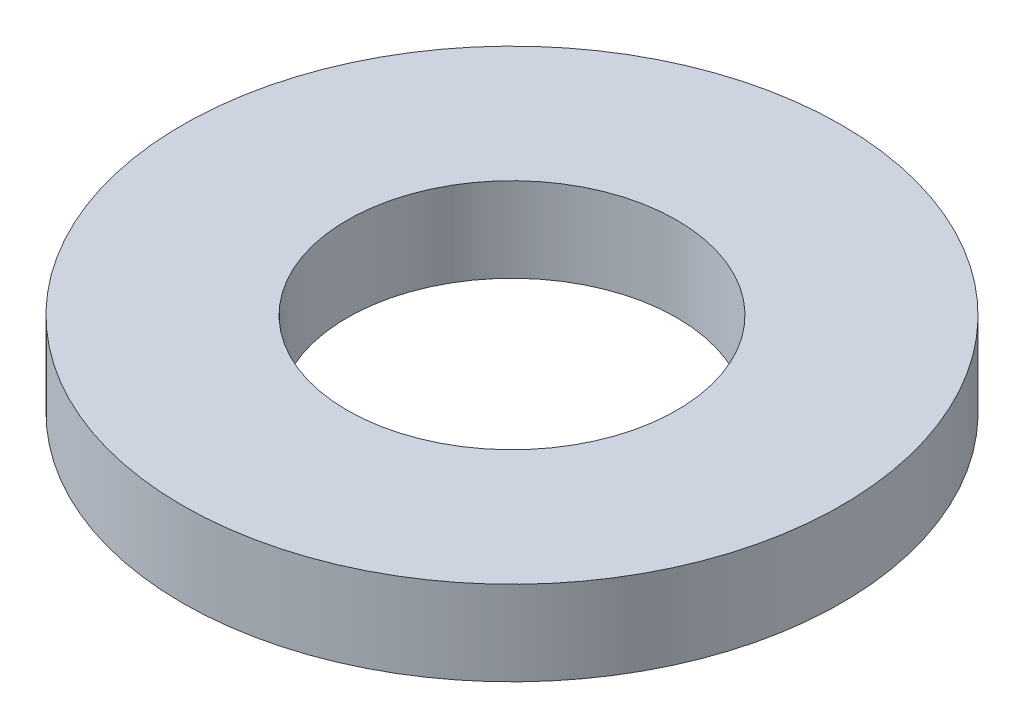
ISO-10303-21;
HEADER;
FILE_DESCRIPTION(('STEP AP214'),'2;1');
FILE_NAME('part.step','',(''),(''),'','','');
FILE_SCHEMA(('AUTOMOTIVE_DESIGN { 1 0 10303 214 1 1 1 1 }'));
ENDSEC;
DATA;
#1=APPLICATION_CONTEXT('core data for automotive mechanical design processes');
#2=APPLICATION_PROTOCOL_DEFINITION('international standard','automotive_design',2000,#1);
#3=PRODUCT_CONTEXT('',#1,'mechanical');
#4=PRODUCT('Part','Part','',(#3));
#5=PRODUCT_RELATED_PRODUCT_CATEGORY('part','',(#4));
#6=PRODUCT_DEFINITION_FORMATION('','',#4);
#7=PRODUCT_DEFINITION_CONTEXT('part definition',#1,'design');
#8=PRODUCT_DEFINITION('design','',#6,#7);
#9=PRODUCT_DEFINITION_SHAPE('','',#8);
#10=(LENGTH_UNIT() NAMED_UNIT(*) SI_UNIT(.MILLI.,.METRE.));
#11=(NAMED_UNIT(*) PLANE_ANGLE_UNIT() SI_UNIT($,.RADIAN.));
#12=(NAMED_UNIT(*) SI_UNIT($,.STERADIAN.) SOLID_ANGLE_UNIT());
#13=UNCERTAINTY_MEASURE_WITH_UNIT(LENGTH_MEASURE(1.E-05),#10,'distance_accuracy_value','');
#14=(GEOMETRIC_REPRESENTATION_CONTEXT(3) GLOBAL_UNCERTAINTY_ASSIGNED_CONTEXT((#13)) GLOBAL_UNIT_ASSIGNED_CONTEXT((#10,
#11,#12)) REPRESENTATION_CONTEXT('',''));
#15=CARTESIAN_POINT('',(0.,0.,0.));
#16=DIRECTION('',(0.,0.,1.));
#17=DIRECTION('',(1.,0.,0.));
#18=AXIS2_PLACEMENT_3D('',#15,#16,#17);
#19=CARTESIAN_POINT('',(0.,1.016,0.));
#20=DIRECTION('',(0.,-1.,0.));
#21=DIRECTION('',(0.,0.,-1.));
#22=AXIS2_PLACEMENT_3D('',#19,#20,#21);
#23=CYLINDRICAL_SURFACE('',#22,3.9624);
#24=CARTESIAN_POINT('',(0.,1.016,0.));
#25=DIRECTION('',(0.,1.,0.));
#26=DIRECTION('',(0.,0.,1.));
#27=AXIS2_PLACEMENT_3D('',#24,#25,#26);
#28=CIRCLE('',#27,3.9624);
#29=CARTESIAN_POINT('',(0.,1.016,3.9624));
#30=VERTEX_POINT('',#29);
#31=EDGE_CURVE('E10',#30,#30,#28,.T.);
#32=ORIENTED_EDGE('',*,*,#31,.F.);
#33=EDGE_LOOP('',(#32));
#34=FACE_BOUND('',#33,.T.);
#35=CARTESIAN_POINT('',(0.,0.,0.));
#36=DIRECTION('',(0.,1.,0.));
#37=DIRECTION('',(0.,0.,1.));
#38=AXIS2_PLACEMENT_3D('',#35,#36,#37);
#39=CIRCLE('',#38,3.9624);
#40=CARTESIAN_POINT('',(0.,0.,3.9624));
#41=VERTEX_POINT('',#40);
#42=EDGE_CURVE('E33',#41,#41,#39,.T.);
#43=ORIENTED_EDGE('',*,*,#42,.T.);
#44=EDGE_LOOP('',(#43));
#45=FACE_BOUND('',#44,.T.);
#46=ADVANCED_FACE('F30',(#34,#45),#23,.T.);
#47=CARTESIAN_POINT('',(0.,1.016,0.));
#48=DIRECTION('',(0.,1.,0.));
#49=DIRECTION('',(0.,0.,1.));
#50=AXIS2_PLACEMENT_3D('',#47,#48,#49);
#51=PLANE('',#50);
#52=CARTESIAN_POINT('',(0.,1.016,0.));
#53=DIRECTION('',(0.,1.,0.));
#54=DIRECTION('',(0.,0.,1.));
#55=AXIS2_PLACEMENT_3D('',#52,#53,#54);
#56=CIRCLE('',#55,1.9812);
#57=CARTESIAN_POINT('',(0.,1.016,1.9812));
#58=VERTEX_POINT('',#57);
#59=EDGE_CURVE('E42',#58,#58,#56,.T.);
#60=ORIENTED_EDGE('',*,*,#59,.F.);
#61=EDGE_LOOP('',(#60));
#62=FACE_BOUND('',#61,.T.);
#63=ORIENTED_EDGE('',*,*,#31,.T.);
#64=EDGE_LOOP('',(#63));
#65=FACE_BOUND('',#64,.T.);
#66=ADVANCED_FACE('F57',(#62,#65),#51,.T.);
#67=CARTESIAN_POINT('',(0.,0.,0.));
#68=DIRECTION('',(0.,1.,0.));
#69=DIRECTION('',(0.,0.,1.));
#70=AXIS2_PLACEMENT_3D('',#67,#68,#69);
#71=PLANE('',#70);
#72=CARTESIAN_POINT('',(0.,0.,0.));
#73=DIRECTION('',(0.,1.,0.));
#74=DIRECTION('',(0.,0.,1.));
#75=AXIS2_PLACEMENT_3D('',#72,#73,#74);
#76=CIRCLE('',#75,1.9812);
#77=CARTESIAN_POINT('',(0.,0.,1.9812));
#78=VERTEX_POINT('',#77);
#79=EDGE_CURVE('E40',#78,#78,#76,.T.);
#80=ORIENTED_EDGE('',*,*,#79,.T.);
#81=EDGE_LOOP('',(#80));
#82=FACE_BOUND('',#81,.T.);
#83=ORIENTED_EDGE('',*,*,#42,.F.);
#84=EDGE_LOOP('',(#83));
#85=FACE_BOUND('',#84,.T.);
#86=ADVANCED_FACE('F48',(#82,#85),#71,.F.);
#87=CARTESIAN_POINT('',(0.,0.,0.));
#88=DIRECTION('',(0.,1.,0.));
#89=DIRECTION('',(0.,0.,1.));
#90=AXIS2_PLACEMENT_3D('',#87,#88,#89);
#91=CYLINDRICAL_SURFACE('',#90,1.9812);
#92=ORIENTED_EDGE('',*,*,#79,.F.);
#93=EDGE_LOOP('',(#92));
#94=FACE_BOUND('',#93,.T.);
#95=ORIENTED_EDGE('',*,*,#59,.T.);
#96=EDGE_LOOP('',(#95));
#97=FACE_BOUND('',#96,.T.);
#98=ADVANCED_FACE('F51',(#94,#97),#91,.F.);
#99=CLOSED_SHELL('',(#46,#66,#86,#98));
#100=MANIFOLD_SOLID_BREP('B2',#99);
#101=ADVANCED_BREP_SHAPE_REPRESENTATION('',(#18,#100),#14);
#102=SHAPE_DEFINITION_REPRESENTATION(#9,#101);
ENDSEC;
END-ISO-10303-21;
